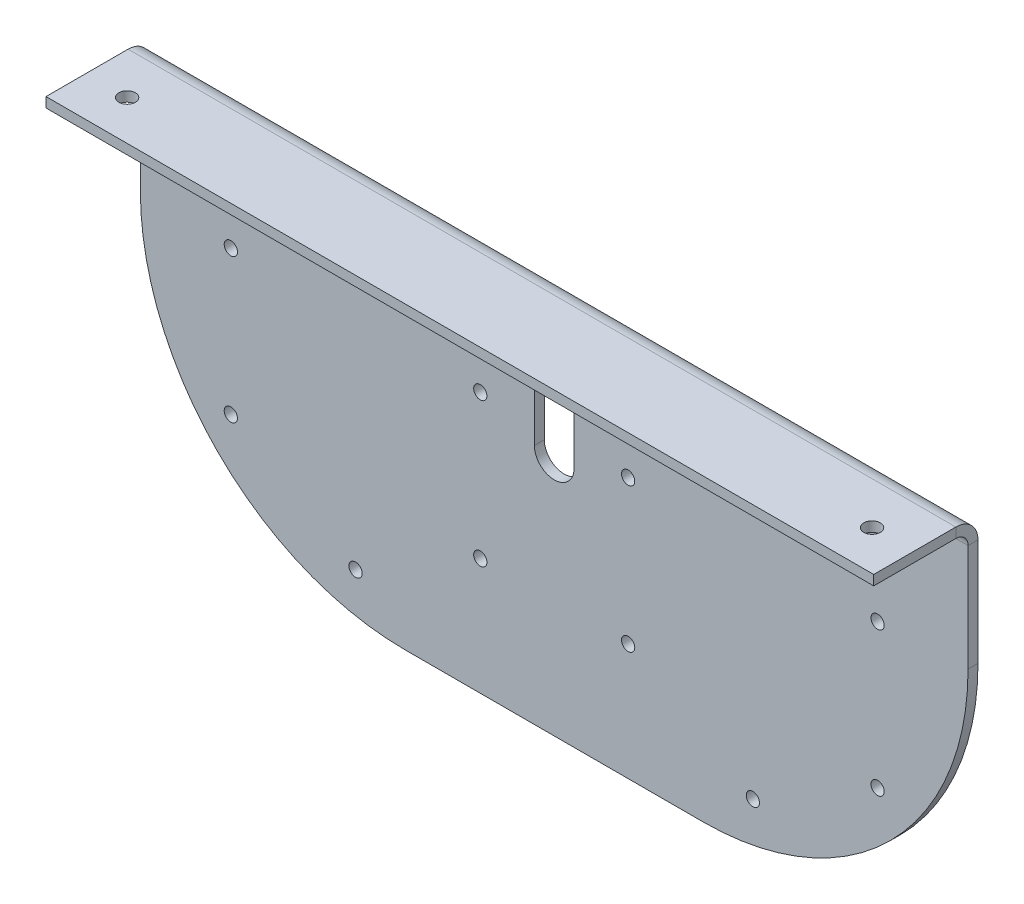
ISO-10303-21;
HEADER;
FILE_DESCRIPTION(('STEP AP214'),'2;1');
FILE_NAME('part.step','',(''),(''),'','','');
FILE_SCHEMA(('AUTOMOTIVE_DESIGN { 1 0 10303 214 1 1 1 1 }'));
ENDSEC;
DATA;
#1=APPLICATION_CONTEXT('core data for automotive mechanical design processes');
#2=APPLICATION_PROTOCOL_DEFINITION('international standard','automotive_design',2000,#1);
#3=PRODUCT_CONTEXT('',#1,'mechanical');
#4=PRODUCT('Part','Part','',(#3));
#5=PRODUCT_RELATED_PRODUCT_CATEGORY('part','',(#4));
#6=PRODUCT_DEFINITION_FORMATION('','',#4);
#7=PRODUCT_DEFINITION_CONTEXT('part definition',#1,'design');
#8=PRODUCT_DEFINITION('design','',#6,#7);
#9=PRODUCT_DEFINITION_SHAPE('','',#8);
#10=(LENGTH_UNIT() NAMED_UNIT(*) SI_UNIT(.MILLI.,.METRE.));
#11=(NAMED_UNIT(*) PLANE_ANGLE_UNIT() SI_UNIT($,.RADIAN.));
#12=(NAMED_UNIT(*) SI_UNIT($,.STERADIAN.) SOLID_ANGLE_UNIT());
#13=UNCERTAINTY_MEASURE_WITH_UNIT(LENGTH_MEASURE(1.E-05),#10,'distance_accuracy_value','');
#14=(GEOMETRIC_REPRESENTATION_CONTEXT(3) GLOBAL_UNCERTAINTY_ASSIGNED_CONTEXT((#13)) GLOBAL_UNIT_ASSIGNED_CONTEXT((#10,
#11,#12)) REPRESENTATION_CONTEXT('',''));
#15=CARTESIAN_POINT('',(0.,0.,0.));
#16=DIRECTION('',(0.,0.,1.));
#17=DIRECTION('',(1.,0.,0.));
#18=AXIS2_PLACEMENT_3D('',#15,#16,#17);
#19=CARTESIAN_POINT('',(-125.,53.5,0.999999999999997));
#20=DIRECTION('',(-1.,0.,0.));
#21=DIRECTION('',(0.,0.,1.));
#22=AXIS2_PLACEMENT_3D('',#19,#20,#21);
#23=PLANE('',#22);
#24=DIRECTION('',(0.,1.,0.));
#25=VECTOR('',#24,1.);
#26=CARTESIAN_POINT('',(-125.,26.5,0.999999999999998));
#27=LINE('',#26,#25);
#28=CARTESIAN_POINT('',(-125.,26.5,0.999999999999998));
#29=VERTEX_POINT('',#28);
#30=CARTESIAN_POINT('',(-125.,58.8,0.999999999999994));
#31=VERTEX_POINT('',#30);
#32=EDGE_CURVE('E351',#29,#31,#27,.T.);
#33=ORIENTED_EDGE('',*,*,#32,.T.);
#34=DIRECTION('',(0.,0.,-1.));
#35=VECTOR('',#34,1.);
#36=CARTESIAN_POINT('',(-125.,58.8,0.999999999999994));
#37=LINE('',#36,#35);
#38=CARTESIAN_POINT('',(-125.,58.8,-2.00000000000001));
#39=VERTEX_POINT('',#38);
#40=EDGE_CURVE('E316',#31,#39,#37,.T.);
#41=ORIENTED_EDGE('',*,*,#40,.T.);
#42=DIRECTION('',(0.,1.,0.));
#43=VECTOR('',#42,1.);
#44=CARTESIAN_POINT('',(-125.,53.5,-2.));
#45=LINE('',#44,#43);
#46=CARTESIAN_POINT('',(-125.,26.5,-2.));
#47=VERTEX_POINT('',#46);
#48=EDGE_CURVE('E370',#47,#39,#45,.T.);
#49=ORIENTED_EDGE('',*,*,#48,.F.);
#50=DIRECTION('',(0.,0.,-1.));
#51=VECTOR('',#50,1.);
#52=CARTESIAN_POINT('',(-125.,26.5,0.999999999999998));
#53=LINE('',#52,#51);
#54=EDGE_CURVE('E73',#29,#47,#53,.T.);
#55=ORIENTED_EDGE('',*,*,#54,.F.);
#56=EDGE_LOOP('',(#33,#41,#49,#55));
#57=FACE_BOUND('',#56,.T.);
#58=ADVANCED_FACE('F63',(#57),#23,.T.);
#59=CARTESIAN_POINT('',(45.,26.5,0.999999999999998));
#60=DIRECTION('',(0.,0.,-1.));
#61=DIRECTION('',(0.,1.,0.));
#62=AXIS2_PLACEMENT_3D('',#59,#60,#61);
#63=PLANE('',#62);
#64=CARTESIAN_POINT('',(-22.327894935377,25.25,0.999999999999997));
#65=DIRECTION('',(0.,0.,-1.));
#66=DIRECTION('',(0.,1.,0.));
#67=AXIS2_PLACEMENT_3D('',#64,#65,#66);
#68=CIRCLE('',#67,2.00000000000001);
#69=CARTESIAN_POINT('',(-22.327894935377,27.25,0.999999999999997));
#70=VERTEX_POINT('',#69);
#71=EDGE_CURVE('E260',#70,#70,#68,.T.);
#72=ORIENTED_EDGE('',*,*,#71,.T.);
#73=EDGE_LOOP('',(#72));
#74=FACE_BOUND('',#73,.T.);
#75=CARTESIAN_POINT('',(22.3278949353769,25.25,0.999999999999997));
#76=DIRECTION('',(0.,0.,-1.));
#77=DIRECTION('',(0.,1.,0.));
#78=AXIS2_PLACEMENT_3D('',#75,#76,#77);
#79=CIRCLE('',#78,2.00000000000001);
#80=CARTESIAN_POINT('',(22.3278949353769,27.25,0.999999999999997));
#81=VERTEX_POINT('',#80);
#82=EDGE_CURVE('E256',#81,#81,#79,.T.);
#83=ORIENTED_EDGE('',*,*,#82,.T.);
#84=EDGE_LOOP('',(#83));
#85=FACE_BOUND('',#84,.T.);
#86=CARTESIAN_POINT('',(22.3278949353769,-18.25,1.));
#87=DIRECTION('',(0.,0.,-1.));
#88=DIRECTION('',(0.,1.,0.));
#89=AXIS2_PLACEMENT_3D('',#86,#87,#88);
#90=CIRCLE('',#89,2.);
#91=CARTESIAN_POINT('',(22.3278949353769,-16.25,1.));
#92=VERTEX_POINT('',#91);
#93=EDGE_CURVE('E252',#92,#92,#90,.T.);
#94=ORIENTED_EDGE('',*,*,#93,.T.);
#95=EDGE_LOOP('',(#94));
#96=FACE_BOUND('',#95,.T.);
#97=CARTESIAN_POINT('',(60.,-40.,1.));
#98=DIRECTION('',(0.,0.,-1.));
#99=DIRECTION('',(0.,1.,0.));
#100=AXIS2_PLACEMENT_3D('',#97,#98,#99);
#101=CIRCLE('',#100,2.);
#102=CARTESIAN_POINT('',(60.,-38.,1.));
#103=VERTEX_POINT('',#102);
#104=EDGE_CURVE('E248',#103,#103,#101,.T.);
#105=ORIENTED_EDGE('',*,*,#104,.T.);
#106=EDGE_LOOP('',(#105));
#107=FACE_BOUND('',#106,.T.);
#108=CARTESIAN_POINT('',(97.6721050646231,-18.25,1.));
#109=DIRECTION('',(0.,0.,-1.));
#110=DIRECTION('',(0.,1.,0.));
#111=AXIS2_PLACEMENT_3D('',#108,#109,#110);
#112=CIRCLE('',#111,2.);
#113=CARTESIAN_POINT('',(97.6721050646231,-16.25,1.));
#114=VERTEX_POINT('',#113);
#115=EDGE_CURVE('E244',#114,#114,#112,.T.);
#116=ORIENTED_EDGE('',*,*,#115,.T.);
#117=EDGE_LOOP('',(#116));
#118=FACE_BOUND('',#117,.T.);
#119=CARTESIAN_POINT('',(-60.0000000000001,47.,0.999999999999997));
#120=DIRECTION('',(0.,0.,-1.));
#121=DIRECTION('',(0.,1.,0.));
#122=AXIS2_PLACEMENT_3D('',#119,#120,#121);
#123=CIRCLE('',#122,2.);
#124=CARTESIAN_POINT('',(-60.0000000000001,49.,0.999999999999996));
#125=VERTEX_POINT('',#124);
#126=EDGE_CURVE('E240',#125,#125,#123,.T.);
#127=ORIENTED_EDGE('',*,*,#126,.T.);
#128=EDGE_LOOP('',(#127));
#129=FACE_BOUND('',#128,.T.);
#130=CARTESIAN_POINT('',(-97.6721050646231,25.25,0.999999999999997));
#131=DIRECTION('',(0.,0.,-1.));
#132=DIRECTION('',(0.,1.,0.));
#133=AXIS2_PLACEMENT_3D('',#130,#131,#132);
#134=CIRCLE('',#133,2.);
#135=CARTESIAN_POINT('',(-97.6721050646231,27.25,0.999999999999997));
#136=VERTEX_POINT('',#135);
#137=EDGE_CURVE('E236',#136,#136,#134,.T.);
#138=ORIENTED_EDGE('',*,*,#137,.T.);
#139=EDGE_LOOP('',(#138));
#140=FACE_BOUND('',#139,.T.);
#141=CARTESIAN_POINT('',(-97.6721050646231,-18.25,1.));
#142=DIRECTION('',(0.,0.,-1.));
#143=DIRECTION('',(0.,1.,0.));
#144=AXIS2_PLACEMENT_3D('',#141,#142,#143);
#145=CIRCLE('',#144,2.);
#146=CARTESIAN_POINT('',(-97.6721050646231,-16.25,1.));
#147=VERTEX_POINT('',#146);
#148=EDGE_CURVE('E232',#147,#147,#145,.T.);
#149=ORIENTED_EDGE('',*,*,#148,.T.);
#150=EDGE_LOOP('',(#149));
#151=FACE_BOUND('',#150,.T.);
#152=CARTESIAN_POINT('',(-22.327894935377,-18.25,1.));
#153=DIRECTION('',(0.,0.,-1.));
#154=DIRECTION('',(0.,1.,0.));
#155=AXIS2_PLACEMENT_3D('',#152,#153,#154);
#156=CIRCLE('',#155,2.);
#157=CARTESIAN_POINT('',(-22.327894935377,-16.25,1.));
#158=VERTEX_POINT('',#157);
#159=EDGE_CURVE('E228',#158,#158,#156,.T.);
#160=ORIENTED_EDGE('',*,*,#159,.T.);
#161=EDGE_LOOP('',(#160));
#162=FACE_BOUND('',#161,.T.);
#163=CARTESIAN_POINT('',(-60.0000000000001,-40.,1.));
#164=DIRECTION('',(0.,0.,-1.));
#165=DIRECTION('',(0.,1.,0.));
#166=AXIS2_PLACEMENT_3D('',#163,#164,#165);
#167=CIRCLE('',#166,2.);
#168=CARTESIAN_POINT('',(-60.0000000000001,-38.,1.));
#169=VERTEX_POINT('',#168);
#170=EDGE_CURVE('E224',#169,#169,#167,.T.);
#171=ORIENTED_EDGE('',*,*,#170,.T.);
#172=EDGE_LOOP('',(#171));
#173=FACE_BOUND('',#172,.T.);
#174=CARTESIAN_POINT('',(60.,47.,0.999999999999997));
#175=DIRECTION('',(0.,0.,-1.));
#176=DIRECTION('',(0.,1.,0.));
#177=AXIS2_PLACEMENT_3D('',#174,#175,#176);
#178=CIRCLE('',#177,2.);
#179=CARTESIAN_POINT('',(60.,49.,0.999999999999996));
#180=VERTEX_POINT('',#179);
#181=EDGE_CURVE('E220',#180,#180,#178,.T.);
#182=ORIENTED_EDGE('',*,*,#181,.T.);
#183=EDGE_LOOP('',(#182));
#184=FACE_BOUND('',#183,.T.);
#185=CARTESIAN_POINT('',(97.6721050646231,25.25,0.999999999999997));
#186=DIRECTION('',(0.,0.,-1.));
#187=DIRECTION('',(0.,1.,0.));
#188=AXIS2_PLACEMENT_3D('',#185,#186,#187);
#189=CIRCLE('',#188,2.);
#190=CARTESIAN_POINT('',(97.6721050646231,27.25,0.999999999999997));
#191=VERTEX_POINT('',#190);
#192=EDGE_CURVE('E216',#191,#191,#189,.T.);
#193=ORIENTED_EDGE('',*,*,#192,.T.);
#194=EDGE_LOOP('',(#193));
#195=FACE_BOUND('',#194,.T.);
#196=DIRECTION('',(0.,1.,0.));
#197=VECTOR('',#196,1.);
#198=CARTESIAN_POINT('',(-6.00000000000001,26.5,0.999999999999998));
#199=LINE('',#198,#197);
#200=CARTESIAN_POINT('',(-6.,19.5,0.999999999999997));
#201=VERTEX_POINT('',#200);
#202=CARTESIAN_POINT('',(-6.,40.5,0.999999999999997));
#203=VERTEX_POINT('',#202);
#204=EDGE_CURVE('E208',#201,#203,#199,.T.);
#205=ORIENTED_EDGE('',*,*,#204,.T.);
#206=CARTESIAN_POINT('',(0.,40.5,0.999999999999997));
#207=DIRECTION('',(0.,0.,-1.));
#208=DIRECTION('',(0.,1.,0.));
#209=AXIS2_PLACEMENT_3D('',#206,#207,#208);
#210=CIRCLE('',#209,6.);
#211=CARTESIAN_POINT('',(6.,40.5,0.999999999999997));
#212=VERTEX_POINT('',#211);
#213=EDGE_CURVE('E212',#203,#212,#210,.T.);
#214=ORIENTED_EDGE('',*,*,#213,.T.);
#215=DIRECTION('',(0.,-1.,0.));
#216=VECTOR('',#215,1.);
#217=CARTESIAN_POINT('',(6.,26.5,0.999999999999998));
#218=LINE('',#217,#216);
#219=CARTESIAN_POINT('',(6.,19.5,0.999999999999998));
#220=VERTEX_POINT('',#219);
#221=EDGE_CURVE('E199',#212,#220,#218,.T.);
#222=ORIENTED_EDGE('',*,*,#221,.T.);
#223=CARTESIAN_POINT('',(0.,19.5,0.999999999999997));
#224=DIRECTION('',(0.,0.,-1.));
#225=DIRECTION('',(0.,1.,0.));
#226=AXIS2_PLACEMENT_3D('',#223,#224,#225);
#227=CIRCLE('',#226,6.);
#228=EDGE_CURVE('E173',#220,#201,#227,.T.);
#229=ORIENTED_EDGE('',*,*,#228,.T.);
#230=EDGE_LOOP('',(#205,#214,#222,#229));
#231=FACE_BOUND('',#230,.T.);
#232=DIRECTION('',(-1.,0.,0.));
#233=VECTOR('',#232,1.);
#234=CARTESIAN_POINT('',(-125.,58.8,0.999999999999994));
#235=LINE('',#234,#233);
#236=CARTESIAN_POINT('',(125.,58.8,0.999999999999994));
#237=VERTEX_POINT('',#236);
#238=EDGE_CURVE('E324',#31,#237,#235,.F.);
#239=ORIENTED_EDGE('',*,*,#238,.F.);
#240=ORIENTED_EDGE('',*,*,#32,.F.);
#241=CARTESIAN_POINT('',(-45.,26.5,0.999999999999998));
#242=DIRECTION('',(0.,0.,-1.));
#243=DIRECTION('',(0.,1.,0.));
#244=AXIS2_PLACEMENT_3D('',#241,#242,#243);
#245=CIRCLE('',#244,80.);
#246=CARTESIAN_POINT('',(-45.,-53.5,1.));
#247=VERTEX_POINT('',#246);
#248=EDGE_CURVE('E347',#247,#29,#245,.T.);
#249=ORIENTED_EDGE('',*,*,#248,.F.);
#250=DIRECTION('',(-1.,0.,0.));
#251=VECTOR('',#250,1.);
#252=CARTESIAN_POINT('',(45.,-53.5,1.));
#253=LINE('',#252,#251);
#254=CARTESIAN_POINT('',(45.,-53.5,1.));
#255=VERTEX_POINT('',#254);
#256=EDGE_CURVE('E342',#255,#247,#253,.T.);
#257=ORIENTED_EDGE('',*,*,#256,.F.);
#258=CARTESIAN_POINT('',(45.,26.5,0.999999999999998));
#259=DIRECTION('',(0.,0.,-1.));
#260=DIRECTION('',(0.,1.,0.));
#261=AXIS2_PLACEMENT_3D('',#258,#259,#260);
#262=CIRCLE('',#261,80.);
#263=CARTESIAN_POINT('',(125.,26.5,0.999999999999998));
#264=VERTEX_POINT('',#263);
#265=EDGE_CURVE('E338',#264,#255,#262,.T.);
#266=ORIENTED_EDGE('',*,*,#265,.F.);
#267=DIRECTION('',(0.,-1.,0.));
#268=VECTOR('',#267,1.);
#269=CARTESIAN_POINT('',(125.,53.5,0.999999999999997));
#270=LINE('',#269,#268);
#271=EDGE_CURVE('E355',#237,#264,#270,.T.);
#272=ORIENTED_EDGE('',*,*,#271,.F.);
#273=EDGE_LOOP('',(#239,#240,#249,#257,#266,#272));
#274=FACE_BOUND('',#273,.T.);
#275=ADVANCED_FACE('F473',(#74,#85,#96,#107,#118,#129,#140,#151,#162,#173,#184,#195,#231,#274),
#63,.F.);
#276=CARTESIAN_POINT('',(45.,26.5,-2.));
#277=DIRECTION('',(0.,0.,-1.));
#278=DIRECTION('',(0.,1.,0.));
#279=AXIS2_PLACEMENT_3D('',#276,#277,#278);
#280=PLANE('',#279);
#281=CARTESIAN_POINT('',(-22.327894935377,25.25,-2.));
#282=DIRECTION('',(0.,0.,-1.));
#283=DIRECTION('',(0.,1.,0.));
#284=AXIS2_PLACEMENT_3D('',#281,#282,#283);
#285=CIRCLE('',#284,2.00000000000001);
#286=CARTESIAN_POINT('',(-22.327894935377,27.25,-2.));
#287=VERTEX_POINT('',#286);
#288=EDGE_CURVE('E408',#287,#287,#285,.T.);
#289=ORIENTED_EDGE('',*,*,#288,.F.);
#290=EDGE_LOOP('',(#289));
#291=FACE_BOUND('',#290,.T.);
#292=CARTESIAN_POINT('',(22.3278949353769,25.25,-2.));
#293=DIRECTION('',(0.,0.,-1.));
#294=DIRECTION('',(0.,1.,0.));
#295=AXIS2_PLACEMENT_3D('',#292,#293,#294);
#296=CIRCLE('',#295,2.00000000000001);
#297=CARTESIAN_POINT('',(22.3278949353769,27.25,-2.));
#298=VERTEX_POINT('',#297);
#299=EDGE_CURVE('E429',#298,#298,#296,.T.);
#300=ORIENTED_EDGE('',*,*,#299,.F.);
#301=EDGE_LOOP('',(#300));
#302=FACE_BOUND('',#301,.T.);
#303=CARTESIAN_POINT('',(22.3278949353769,-18.25,-2.));
#304=DIRECTION('',(0.,0.,-1.));
#305=DIRECTION('',(0.,1.,0.));
#306=AXIS2_PLACEMENT_3D('',#303,#304,#305);
#307=CIRCLE('',#306,2.);
#308=CARTESIAN_POINT('',(22.3278949353769,-16.25,-2.));
#309=VERTEX_POINT('',#308);
#310=EDGE_CURVE('E425',#309,#309,#307,.T.);
#311=ORIENTED_EDGE('',*,*,#310,.F.);
#312=EDGE_LOOP('',(#311));
#313=FACE_BOUND('',#312,.T.);
#314=CARTESIAN_POINT('',(60.,-40.,-2.));
#315=DIRECTION('',(0.,0.,-1.));
#316=DIRECTION('',(0.,1.,0.));
#317=AXIS2_PLACEMENT_3D('',#314,#315,#316);
#318=CIRCLE('',#317,2.);
#319=CARTESIAN_POINT('',(60.,-38.,-2.));
#320=VERTEX_POINT('',#319);
#321=EDGE_CURVE('E420',#320,#320,#318,.T.);
#322=ORIENTED_EDGE('',*,*,#321,.F.);
#323=EDGE_LOOP('',(#322));
#324=FACE_BOUND('',#323,.T.);
#325=CARTESIAN_POINT('',(97.6721050646231,-18.25,-2.));
#326=DIRECTION('',(0.,0.,-1.));
#327=DIRECTION('',(0.,1.,0.));
#328=AXIS2_PLACEMENT_3D('',#325,#326,#327);
#329=CIRCLE('',#328,2.);
#330=CARTESIAN_POINT('',(97.6721050646231,-16.25,-2.));
#331=VERTEX_POINT('',#330);
#332=EDGE_CURVE('E424',#331,#331,#329,.T.);
#333=ORIENTED_EDGE('',*,*,#332,.F.);
#334=EDGE_LOOP('',(#333));
#335=FACE_BOUND('',#334,.T.);
#336=CARTESIAN_POINT('',(-60.0000000000001,47.,-2.));
#337=DIRECTION('',(0.,0.,-1.));
#338=DIRECTION('',(0.,1.,0.));
#339=AXIS2_PLACEMENT_3D('',#336,#337,#338);
#340=CIRCLE('',#339,2.);
#341=CARTESIAN_POINT('',(-60.0000000000001,49.,-2.));
#342=VERTEX_POINT('',#341);
#343=EDGE_CURVE('E444',#342,#342,#340,.T.);
#344=ORIENTED_EDGE('',*,*,#343,.F.);
#345=EDGE_LOOP('',(#344));
#346=FACE_BOUND('',#345,.T.);
#347=CARTESIAN_POINT('',(-97.6721050646231,25.25,-2.));
#348=DIRECTION('',(0.,0.,-1.));
#349=DIRECTION('',(0.,1.,0.));
#350=AXIS2_PLACEMENT_3D('',#347,#348,#349);
#351=CIRCLE('',#350,2.);
#352=CARTESIAN_POINT('',(-97.6721050646231,27.25,-2.));
#353=VERTEX_POINT('',#352);
#354=EDGE_CURVE('E440',#353,#353,#351,.T.);
#355=ORIENTED_EDGE('',*,*,#354,.F.);
#356=EDGE_LOOP('',(#355));
#357=FACE_BOUND('',#356,.T.);
#358=CARTESIAN_POINT('',(-97.6721050646231,-18.25,-2.));
#359=DIRECTION('',(0.,0.,-1.));
#360=DIRECTION('',(0.,1.,0.));
#361=AXIS2_PLACEMENT_3D('',#358,#359,#360);
#362=CIRCLE('',#361,2.);
#363=CARTESIAN_POINT('',(-97.6721050646231,-16.25,-2.));
#364=VERTEX_POINT('',#363);
#365=EDGE_CURVE('E436',#364,#364,#362,.T.);
#366=ORIENTED_EDGE('',*,*,#365,.F.);
#367=EDGE_LOOP('',(#366));
#368=FACE_BOUND('',#367,.T.);
#369=CARTESIAN_POINT('',(-22.327894935377,-18.25,-2.));
#370=DIRECTION('',(0.,0.,-1.));
#371=DIRECTION('',(0.,1.,0.));
#372=AXIS2_PLACEMENT_3D('',#369,#370,#371);
#373=CIRCLE('',#372,2.);
#374=CARTESIAN_POINT('',(-22.327894935377,-16.25,-2.));
#375=VERTEX_POINT('',#374);
#376=EDGE_CURVE('E404',#375,#375,#373,.T.);
#377=ORIENTED_EDGE('',*,*,#376,.F.);
#378=EDGE_LOOP('',(#377));
#379=FACE_BOUND('',#378,.T.);
#380=CARTESIAN_POINT('',(-60.0000000000001,-40.,-2.));
#381=DIRECTION('',(0.,0.,-1.));
#382=DIRECTION('',(0.,1.,0.));
#383=AXIS2_PLACEMENT_3D('',#380,#381,#382);
#384=CIRCLE('',#383,2.);
#385=CARTESIAN_POINT('',(-60.0000000000001,-38.,-2.));
#386=VERTEX_POINT('',#385);
#387=EDGE_CURVE('E409',#386,#386,#384,.T.);
#388=ORIENTED_EDGE('',*,*,#387,.F.);
#389=EDGE_LOOP('',(#388));
#390=FACE_BOUND('',#389,.T.);
#391=CARTESIAN_POINT('',(60.,47.,-2.));
#392=DIRECTION('',(0.,0.,-1.));
#393=DIRECTION('',(0.,1.,0.));
#394=AXIS2_PLACEMENT_3D('',#391,#392,#393);
#395=CIRCLE('',#394,2.);
#396=CARTESIAN_POINT('',(60.,49.,-2.));
#397=VERTEX_POINT('',#396);
#398=EDGE_CURVE('E413',#397,#397,#395,.T.);
#399=ORIENTED_EDGE('',*,*,#398,.F.);
#400=EDGE_LOOP('',(#399));
#401=FACE_BOUND('',#400,.T.);
#402=CARTESIAN_POINT('',(97.6721050646231,25.25,-2.));
#403=DIRECTION('',(0.,0.,-1.));
#404=DIRECTION('',(0.,1.,0.));
#405=AXIS2_PLACEMENT_3D('',#402,#403,#404);
#406=CIRCLE('',#405,2.);
#407=CARTESIAN_POINT('',(97.6721050646231,27.25,-2.));
#408=VERTEX_POINT('',#407);
#409=EDGE_CURVE('E393',#408,#408,#406,.T.);
#410=ORIENTED_EDGE('',*,*,#409,.F.);
#411=EDGE_LOOP('',(#410));
#412=FACE_BOUND('',#411,.T.);
#413=CARTESIAN_POINT('',(0.,40.5,-2.));
#414=DIRECTION('',(0.,0.,-1.));
#415=DIRECTION('',(0.,1.,0.));
#416=AXIS2_PLACEMENT_3D('',#413,#414,#415);
#417=CIRCLE('',#416,6.);
#418=CARTESIAN_POINT('',(-6.,40.5,-2.));
#419=VERTEX_POINT('',#418);
#420=CARTESIAN_POINT('',(6.,40.5,-2.));
#421=VERTEX_POINT('',#420);
#422=EDGE_CURVE('E89',#419,#421,#417,.T.);
#423=ORIENTED_EDGE('',*,*,#422,.F.);
#424=DIRECTION('',(0.,1.,0.));
#425=VECTOR('',#424,1.);
#426=CARTESIAN_POINT('',(-6.,19.5,-2.));
#427=LINE('',#426,#425);
#428=CARTESIAN_POINT('',(-6.,19.5,-2.));
#429=VERTEX_POINT('',#428);
#430=EDGE_CURVE('E188',#429,#419,#427,.T.);
#431=ORIENTED_EDGE('',*,*,#430,.F.);
#432=CARTESIAN_POINT('',(0.,19.5,-2.));
#433=DIRECTION('',(0.,0.,-1.));
#434=DIRECTION('',(0.,1.,0.));
#435=AXIS2_PLACEMENT_3D('',#432,#433,#434);
#436=CIRCLE('',#435,6.);
#437=CARTESIAN_POINT('',(6.,19.5,-2.));
#438=VERTEX_POINT('',#437);
#439=EDGE_CURVE('E170',#438,#429,#436,.T.);
#440=ORIENTED_EDGE('',*,*,#439,.F.);
#441=DIRECTION('',(0.,-1.,0.));
#442=VECTOR('',#441,1.);
#443=CARTESIAN_POINT('',(6.,40.5,-2.));
#444=LINE('',#443,#442);
#445=EDGE_CURVE('E180',#421,#438,#444,.T.);
#446=ORIENTED_EDGE('',*,*,#445,.F.);
#447=EDGE_LOOP('',(#423,#431,#440,#446));
#448=FACE_BOUND('',#447,.T.);
#449=ORIENTED_EDGE('',*,*,#48,.T.);
#450=DIRECTION('',(-1.,0.,0.));
#451=VECTOR('',#450,1.);
#452=CARTESIAN_POINT('',(-125.,58.8,-2.00000000000001));
#453=LINE('',#452,#451);
#454=CARTESIAN_POINT('',(125.,58.8,-2.));
#455=VERTEX_POINT('',#454);
#456=EDGE_CURVE('E307',#39,#455,#453,.F.);
#457=ORIENTED_EDGE('',*,*,#456,.T.);
#458=DIRECTION('',(0.,-1.,0.));
#459=VECTOR('',#458,1.);
#460=CARTESIAN_POINT('',(125.,53.5,-2.));
#461=LINE('',#460,#459);
#462=CARTESIAN_POINT('',(125.,26.5,-2.));
#463=VERTEX_POINT('',#462);
#464=EDGE_CURVE('E343',#455,#463,#461,.T.);
#465=ORIENTED_EDGE('',*,*,#464,.T.);
#466=CARTESIAN_POINT('',(45.,26.5,-2.));
#467=DIRECTION('',(0.,0.,-1.));
#468=DIRECTION('',(0.,1.,0.));
#469=AXIS2_PLACEMENT_3D('',#466,#467,#468);
#470=CIRCLE('',#469,80.);
#471=CARTESIAN_POINT('',(45.,-53.5,-2.));
#472=VERTEX_POINT('',#471);
#473=EDGE_CURVE('E334',#463,#472,#470,.T.);
#474=ORIENTED_EDGE('',*,*,#473,.T.);
#475=DIRECTION('',(-1.,0.,0.));
#476=VECTOR('',#475,1.);
#477=CARTESIAN_POINT('',(45.,-53.5,-2.));
#478=LINE('',#477,#476);
#479=CARTESIAN_POINT('',(-45.,-53.5,-2.));
#480=VERTEX_POINT('',#479);
#481=EDGE_CURVE('E362',#472,#480,#478,.T.);
#482=ORIENTED_EDGE('',*,*,#481,.T.);
#483=CARTESIAN_POINT('',(-45.,26.5,-2.));
#484=DIRECTION('',(0.,0.,-1.));
#485=DIRECTION('',(0.,1.,0.));
#486=AXIS2_PLACEMENT_3D('',#483,#484,#485);
#487=CIRCLE('',#486,80.);
#488=EDGE_CURVE('E366',#480,#47,#487,.T.);
#489=ORIENTED_EDGE('',*,*,#488,.T.);
#490=EDGE_LOOP('',(#449,#457,#465,#474,#482,#489));
#491=FACE_BOUND('',#490,.T.);
#492=ADVANCED_FACE('F185',(#291,#302,#313,#324,#335,#346,#357,#368,#379,#390,#401,#412,#448,
#491),#280,.T.);
#493=CARTESIAN_POINT('',(45.,26.5,0.999999999999998));
#494=DIRECTION('',(0.,0.,-1.));
#495=DIRECTION('',(0.,1.,0.));
#496=AXIS2_PLACEMENT_3D('',#493,#494,#495);
#497=CYLINDRICAL_SURFACE('',#496,80.);
#498=ORIENTED_EDGE('',*,*,#473,.F.);
#499=DIRECTION('',(0.,0.,-1.));
#500=VECTOR('',#499,1.);
#501=CARTESIAN_POINT('',(125.,26.5,0.999999999999998));
#502=LINE('',#501,#500);
#503=EDGE_CURVE('E13',#264,#463,#502,.T.);
#504=ORIENTED_EDGE('',*,*,#503,.F.);
#505=ORIENTED_EDGE('',*,*,#265,.T.);
#506=DIRECTION('',(0.,0.,-1.));
#507=VECTOR('',#506,1.);
#508=CARTESIAN_POINT('',(45.,-53.5,1.));
#509=LINE('',#508,#507);
#510=EDGE_CURVE('E358',#255,#472,#509,.T.);
#511=ORIENTED_EDGE('',*,*,#510,.T.);
#512=EDGE_LOOP('',(#498,#504,#505,#511));
#513=FACE_BOUND('',#512,.T.);
#514=ADVANCED_FACE('F65',(#513),#497,.T.);
#515=CARTESIAN_POINT('',(125.,53.5,0.999999999999997));
#516=DIRECTION('',(1.,0.,0.));
#517=DIRECTION('',(0.,0.,-1.));
#518=AXIS2_PLACEMENT_3D('',#515,#516,#517);
#519=PLANE('',#518);
#520=DIRECTION('',(0.,0.,-1.));
#521=VECTOR('',#520,1.);
#522=CARTESIAN_POINT('',(125.,58.8,0.999999999999994));
#523=LINE('',#522,#521);
#524=EDGE_CURVE('E330',#237,#455,#523,.T.);
#525=ORIENTED_EDGE('',*,*,#524,.F.);
#526=ORIENTED_EDGE('',*,*,#271,.T.);
#527=ORIENTED_EDGE('',*,*,#503,.T.);
#528=ORIENTED_EDGE('',*,*,#464,.F.);
#529=EDGE_LOOP('',(#525,#526,#527,#528));
#530=FACE_BOUND('',#529,.T.);
#531=ADVANCED_FACE('F523',(#530),#519,.T.);
#532=CARTESIAN_POINT('',(-45.,26.5,0.999999999999998));
#533=DIRECTION('',(0.,0.,-1.));
#534=DIRECTION('',(0.,1.,0.));
#535=AXIS2_PLACEMENT_3D('',#532,#533,#534);
#536=CYLINDRICAL_SURFACE('',#535,80.);
#537=ORIENTED_EDGE('',*,*,#488,.F.);
#538=DIRECTION('',(0.,0.,-1.));
#539=VECTOR('',#538,1.);
#540=CARTESIAN_POINT('',(-45.,-53.5,1.));
#541=LINE('',#540,#539);
#542=EDGE_CURVE('E379',#247,#480,#541,.T.);
#543=ORIENTED_EDGE('',*,*,#542,.F.);
#544=ORIENTED_EDGE('',*,*,#248,.T.);
#545=ORIENTED_EDGE('',*,*,#54,.T.);
#546=EDGE_LOOP('',(#537,#543,#544,#545));
#547=FACE_BOUND('',#546,.T.);
#548=ADVANCED_FACE('F512',(#547),#536,.T.);
#549=CARTESIAN_POINT('',(45.,-53.5,1.));
#550=DIRECTION('',(0.,-1.,0.));
#551=DIRECTION('',(0.,0.,-1.));
#552=AXIS2_PLACEMENT_3D('',#549,#550,#551);
#553=PLANE('',#552);
#554=ORIENTED_EDGE('',*,*,#481,.F.);
#555=ORIENTED_EDGE('',*,*,#510,.F.);
#556=ORIENTED_EDGE('',*,*,#256,.T.);
#557=ORIENTED_EDGE('',*,*,#542,.T.);
#558=EDGE_LOOP('',(#554,#555,#556,#557));
#559=FACE_BOUND('',#558,.T.);
#560=ADVANCED_FACE('F516',(#559),#553,.T.);
#561=CARTESIAN_POINT('',(125.,58.8,4.69999999999999));
#562=DIRECTION('',(1.,0.,0.));
#563=DIRECTION('',(0.,0.,-1.));
#564=AXIS2_PLACEMENT_3D('',#561,#562,#563);
#565=PLANE('',#564);
#566=DIRECTION('',(0.,-1.,0.));
#567=VECTOR('',#566,1.);
#568=CARTESIAN_POINT('',(125.,65.5,4.69999999999997));
#569=LINE('',#568,#567);
#570=CARTESIAN_POINT('',(125.,62.5,4.69999999999998));
#571=VERTEX_POINT('',#570);
#572=CARTESIAN_POINT('',(125.,65.5,4.69999999999997));
#573=VERTEX_POINT('',#572);
#574=EDGE_CURVE('E264',#571,#573,#569,.F.);
#575=ORIENTED_EDGE('',*,*,#574,.F.);
#576=CARTESIAN_POINT('',(125.,58.8,4.69999999999999));
#577=DIRECTION('',(-1.,0.,0.));
#578=DIRECTION('',(0.,0.,1.));
#579=AXIS2_PLACEMENT_3D('',#576,#577,#578);
#580=CIRCLE('',#579,3.7);
#581=EDGE_CURVE('E320',#237,#571,#580,.F.);
#582=ORIENTED_EDGE('',*,*,#581,.F.);
#583=ORIENTED_EDGE('',*,*,#524,.T.);
#584=CARTESIAN_POINT('',(125.,58.8,4.69999999999999));
#585=DIRECTION('',(-1.,0.,0.));
#586=DIRECTION('',(0.,0.,1.));
#587=AXIS2_PLACEMENT_3D('',#584,#585,#586);
#588=CIRCLE('',#587,6.7);
#589=EDGE_CURVE('E311',#455,#573,#588,.F.);
#590=ORIENTED_EDGE('',*,*,#589,.T.);
#591=EDGE_LOOP('',(#575,#582,#583,#590));
#592=FACE_BOUND('',#591,.T.);
#593=ADVANCED_FACE('F525',(#592),#565,.T.);
#594=CARTESIAN_POINT('',(-125.,58.8,4.69999999999999));
#595=DIRECTION('',(1.,0.,0.));
#596=DIRECTION('',(0.,0.,-1.));
#597=AXIS2_PLACEMENT_3D('',#594,#595,#596);
#598=PLANE('',#597);
#599=CARTESIAN_POINT('',(-125.,58.8,4.69999999999999));
#600=DIRECTION('',(-1.,0.,0.));
#601=DIRECTION('',(0.,0.,1.));
#602=AXIS2_PLACEMENT_3D('',#599,#600,#601);
#603=CIRCLE('',#602,3.7);
#604=CARTESIAN_POINT('',(-125.,62.5,4.69999999999998));
#605=VERTEX_POINT('',#604);
#606=EDGE_CURVE('E269',#605,#31,#603,.T.);
#607=ORIENTED_EDGE('',*,*,#606,.F.);
#608=DIRECTION('',(0.,-1.,0.));
#609=VECTOR('',#608,1.);
#610=CARTESIAN_POINT('',(-125.,62.5,4.69999999999998));
#611=LINE('',#610,#609);
#612=CARTESIAN_POINT('',(-125.,65.5,4.69999999999997));
#613=VERTEX_POINT('',#612);
#614=EDGE_CURVE('E297',#605,#613,#611,.F.);
#615=ORIENTED_EDGE('',*,*,#614,.T.);
#616=CARTESIAN_POINT('',(-125.,58.8,4.69999999999999));
#617=DIRECTION('',(-1.,0.,0.));
#618=DIRECTION('',(0.,0.,1.));
#619=AXIS2_PLACEMENT_3D('',#616,#617,#618);
#620=CIRCLE('',#619,6.7);
#621=EDGE_CURVE('E312',#613,#39,#620,.T.);
#622=ORIENTED_EDGE('',*,*,#621,.T.);
#623=ORIENTED_EDGE('',*,*,#40,.F.);
#624=EDGE_LOOP('',(#607,#615,#622,#623));
#625=FACE_BOUND('',#624,.T.);
#626=ADVANCED_FACE('F530',(#625),#598,.F.);
#627=CARTESIAN_POINT('',(-125.,58.8,4.69999999999999));
#628=DIRECTION('',(-1.,0.,0.));
#629=DIRECTION('',(0.,1.,0.));
#630=AXIS2_PLACEMENT_3D('',#627,#628,#629);
#631=CYLINDRICAL_SURFACE('',#630,6.7);
#632=ORIENTED_EDGE('',*,*,#456,.F.);
#633=ORIENTED_EDGE('',*,*,#621,.F.);
#634=DIRECTION('',(-1.,0.,0.));
#635=VECTOR('',#634,1.);
#636=CARTESIAN_POINT('',(125.,65.5,4.69999999999997));
#637=LINE('',#636,#635);
#638=EDGE_CURVE('E294',#613,#573,#637,.F.);
#639=ORIENTED_EDGE('',*,*,#638,.T.);
#640=ORIENTED_EDGE('',*,*,#589,.F.);
#641=EDGE_LOOP('',(#632,#633,#639,#640));
#642=FACE_BOUND('',#641,.T.);
#643=ADVANCED_FACE('F527',(#642),#631,.T.);
#644=CARTESIAN_POINT('',(-125.,58.8,4.69999999999999));
#645=DIRECTION('',(-1.,0.,0.));
#646=DIRECTION('',(0.,1.,0.));
#647=AXIS2_PLACEMENT_3D('',#644,#645,#646);
#648=CYLINDRICAL_SURFACE('',#647,3.7);
#649=ORIENTED_EDGE('',*,*,#238,.T.);
#650=ORIENTED_EDGE('',*,*,#581,.T.);
#651=DIRECTION('',(-1.,0.,0.));
#652=VECTOR('',#651,1.);
#653=CARTESIAN_POINT('',(125.,62.5,4.69999999999998));
#654=LINE('',#653,#652);
#655=EDGE_CURVE('E301',#571,#605,#654,.T.);
#656=ORIENTED_EDGE('',*,*,#655,.T.);
#657=ORIENTED_EDGE('',*,*,#606,.T.);
#658=EDGE_LOOP('',(#649,#650,#656,#657));
#659=FACE_BOUND('',#658,.T.);
#660=ADVANCED_FACE('F550',(#659),#648,.F.);
#661=CARTESIAN_POINT('',(-125.,65.5000000000001,29.5));
#662=DIRECTION('',(1.,0.,0.));
#663=DIRECTION('',(0.,0.,-1.));
#664=AXIS2_PLACEMENT_3D('',#661,#662,#663);
#665=PLANE('',#664);
#666=ORIENTED_EDGE('',*,*,#614,.F.);
#667=DIRECTION('',(0.,0.,-1.));
#668=VECTOR('',#667,1.);
#669=CARTESIAN_POINT('',(-125.,62.5000000000001,29.5));
#670=LINE('',#669,#668);
#671=CARTESIAN_POINT('',(-125.,62.5000000000001,29.5));
#672=VERTEX_POINT('',#671);
#673=EDGE_CURVE('E291',#605,#672,#670,.F.);
#674=ORIENTED_EDGE('',*,*,#673,.T.);
#675=DIRECTION('',(0.,-1.,0.));
#676=VECTOR('',#675,1.);
#677=CARTESIAN_POINT('',(-125.,65.5000000000001,29.5));
#678=LINE('',#677,#676);
#679=CARTESIAN_POINT('',(-125.,65.5000000000001,29.5));
#680=VERTEX_POINT('',#679);
#681=EDGE_CURVE('E265',#680,#672,#678,.T.);
#682=ORIENTED_EDGE('',*,*,#681,.F.);
#683=DIRECTION('',(0.,0.,1.));
#684=VECTOR('',#683,1.);
#685=CARTESIAN_POINT('',(-125.,65.5,-2.33736398749264E-13));
#686=LINE('',#685,#684);
#687=EDGE_CURVE('E281',#613,#680,#686,.T.);
#688=ORIENTED_EDGE('',*,*,#687,.F.);
#689=EDGE_LOOP('',(#666,#674,#682,#688));
#690=FACE_BOUND('',#689,.T.);
#691=ADVANCED_FACE('F541',(#690),#665,.F.);
#692=CARTESIAN_POINT('',(125.,65.5,0.999999999999985));
#693=DIRECTION('',(-1.,0.,0.));
#694=DIRECTION('',(0.,0.,1.));
#695=AXIS2_PLACEMENT_3D('',#692,#693,#694);
#696=PLANE('',#695);
#697=ORIENTED_EDGE('',*,*,#574,.T.);
#698=DIRECTION('',(0.,0.,-1.));
#699=VECTOR('',#698,1.);
#700=CARTESIAN_POINT('',(125.,65.5,-2.33736398749264E-13));
#701=LINE('',#700,#699);
#702=CARTESIAN_POINT('',(125.,65.5000000000001,29.5));
#703=VERTEX_POINT('',#702);
#704=EDGE_CURVE('E274',#703,#573,#701,.T.);
#705=ORIENTED_EDGE('',*,*,#704,.F.);
#706=DIRECTION('',(0.,-1.,0.));
#707=VECTOR('',#706,1.);
#708=CARTESIAN_POINT('',(125.,65.5000000000001,29.5));
#709=LINE('',#708,#707);
#710=CARTESIAN_POINT('',(125.,62.5000000000001,29.5));
#711=VERTEX_POINT('',#710);
#712=EDGE_CURVE('E270',#703,#711,#709,.T.);
#713=ORIENTED_EDGE('',*,*,#712,.T.);
#714=DIRECTION('',(0.,0.,1.));
#715=VECTOR('',#714,1.);
#716=CARTESIAN_POINT('',(125.,62.5,0.999999999999995));
#717=LINE('',#716,#715);
#718=EDGE_CURVE('E284',#711,#571,#717,.F.);
#719=ORIENTED_EDGE('',*,*,#718,.T.);
#720=EDGE_LOOP('',(#697,#705,#713,#719));
#721=FACE_BOUND('',#720,.T.);
#722=ADVANCED_FACE('F548',(#721),#696,.F.);
#723=CARTESIAN_POINT('',(0.,65.5,-2.33736398749264E-13));
#724=DIRECTION('',(0.,-1.,0.));
#725=DIRECTION('',(0.,0.,-1.));
#726=AXIS2_PLACEMENT_3D('',#723,#724,#725);
#727=PLANE('',#726);
#728=CARTESIAN_POINT('',(-112.5,65.5,17.5));
#729=DIRECTION('',(0.,1.,0.));
#730=DIRECTION('',(0.,0.,1.));
#731=AXIS2_PLACEMENT_3D('',#728,#729,#730);
#732=CIRCLE('',#731,2.49999999999999);
#733=CARTESIAN_POINT('',(-112.5,65.5000000000001,20.));
#734=VERTEX_POINT('',#733);
#735=EDGE_CURVE('E386',#734,#734,#732,.T.);
#736=ORIENTED_EDGE('',*,*,#735,.F.);
#737=EDGE_LOOP('',(#736));
#738=FACE_BOUND('',#737,.T.);
#739=CARTESIAN_POINT('',(112.5,65.5,17.5));
#740=DIRECTION('',(0.,1.,0.));
#741=DIRECTION('',(0.,0.,1.));
#742=AXIS2_PLACEMENT_3D('',#739,#740,#741);
#743=CIRCLE('',#742,2.50000000000001);
#744=CARTESIAN_POINT('',(112.5,65.5000000000001,20.));
#745=VERTEX_POINT('',#744);
#746=EDGE_CURVE('E395',#745,#745,#743,.T.);
#747=ORIENTED_EDGE('',*,*,#746,.F.);
#748=EDGE_LOOP('',(#747));
#749=FACE_BOUND('',#748,.T.);
#750=ORIENTED_EDGE('',*,*,#638,.F.);
#751=ORIENTED_EDGE('',*,*,#687,.T.);
#752=DIRECTION('',(1.,0.,0.));
#753=VECTOR('',#752,1.);
#754=CARTESIAN_POINT('',(0.,65.5000000000001,29.5));
#755=LINE('',#754,#753);
#756=EDGE_CURVE('E278',#680,#703,#755,.T.);
#757=ORIENTED_EDGE('',*,*,#756,.T.);
#758=ORIENTED_EDGE('',*,*,#704,.T.);
#759=EDGE_LOOP('',(#750,#751,#757,#758));
#760=FACE_BOUND('',#759,.T.);
#761=ADVANCED_FACE('F537',(#738,#749,#760),#727,.F.);
#762=CARTESIAN_POINT('',(0.,62.5,-2.23079565582223E-13));
#763=DIRECTION('',(0.,-1.,0.));
#764=DIRECTION('',(0.,0.,-1.));
#765=AXIS2_PLACEMENT_3D('',#762,#763,#764);
#766=PLANE('',#765);
#767=CARTESIAN_POINT('',(-112.5,62.5,17.5));
#768=DIRECTION('',(0.,-1.,0.));
#769=DIRECTION('',(0.,0.,-1.));
#770=AXIS2_PLACEMENT_3D('',#767,#768,#769);
#771=CIRCLE('',#770,2.49999999999999);
#772=CARTESIAN_POINT('',(-112.5,62.5,15.));
#773=VERTEX_POINT('',#772);
#774=EDGE_CURVE('E67',#773,#773,#771,.T.);
#775=ORIENTED_EDGE('',*,*,#774,.F.);
#776=EDGE_LOOP('',(#775));
#777=FACE_BOUND('',#776,.T.);
#778=CARTESIAN_POINT('',(112.5,62.5,17.5));
#779=DIRECTION('',(0.,-1.,0.));
#780=DIRECTION('',(0.,0.,-1.));
#781=AXIS2_PLACEMENT_3D('',#778,#779,#780);
#782=CIRCLE('',#781,2.50000000000001);
#783=CARTESIAN_POINT('',(112.5,62.5,15.));
#784=VERTEX_POINT('',#783);
#785=EDGE_CURVE('E383',#784,#784,#782,.T.);
#786=ORIENTED_EDGE('',*,*,#785,.F.);
#787=EDGE_LOOP('',(#786));
#788=FACE_BOUND('',#787,.T.);
#789=ORIENTED_EDGE('',*,*,#673,.F.);
#790=ORIENTED_EDGE('',*,*,#655,.F.);
#791=ORIENTED_EDGE('',*,*,#718,.F.);
#792=DIRECTION('',(-1.,0.,0.));
#793=VECTOR('',#792,1.);
#794=CARTESIAN_POINT('',(125.,62.5000000000001,29.5));
#795=LINE('',#794,#793);
#796=EDGE_CURVE('E288',#672,#711,#795,.F.);
#797=ORIENTED_EDGE('',*,*,#796,.F.);
#798=EDGE_LOOP('',(#789,#790,#791,#797));
#799=FACE_BOUND('',#798,.T.);
#800=ADVANCED_FACE('F552',(#777,#788,#799),#766,.T.);
#801=CARTESIAN_POINT('',(125.,65.5000000000001,29.5));
#802=DIRECTION('',(0.,0.,-1.));
#803=DIRECTION('',(0.,1.,0.));
#804=AXIS2_PLACEMENT_3D('',#801,#802,#803);
#805=PLANE('',#804);
#806=ORIENTED_EDGE('',*,*,#796,.T.);
#807=ORIENTED_EDGE('',*,*,#712,.F.);
#808=ORIENTED_EDGE('',*,*,#756,.F.);
#809=ORIENTED_EDGE('',*,*,#681,.T.);
#810=EDGE_LOOP('',(#806,#807,#808,#809));
#811=FACE_BOUND('',#810,.T.);
#812=ADVANCED_FACE('F544',(#811),#805,.F.);
#813=CARTESIAN_POINT('',(0.,40.5,8.));
#814=DIRECTION('',(0.,0.,-1.));
#815=DIRECTION('',(0.,1.,0.));
#816=AXIS2_PLACEMENT_3D('',#813,#814,#815);
#817=CYLINDRICAL_SURFACE('',#816,6.);
#818=DIRECTION('',(0.,0.,-1.));
#819=VECTOR('',#818,1.);
#820=CARTESIAN_POINT('',(-6.,40.5,8.));
#821=LINE('',#820,#819);
#822=EDGE_CURVE('E196',#203,#419,#821,.T.);
#823=ORIENTED_EDGE('',*,*,#822,.T.);
#824=ORIENTED_EDGE('',*,*,#422,.T.);
#825=DIRECTION('',(0.,0.,-1.));
#826=VECTOR('',#825,1.);
#827=CARTESIAN_POINT('',(6.,40.5,8.));
#828=LINE('',#827,#826);
#829=EDGE_CURVE('E177',#212,#421,#828,.T.);
#830=ORIENTED_EDGE('',*,*,#829,.F.);
#831=ORIENTED_EDGE('',*,*,#213,.F.);
#832=EDGE_LOOP('',(#823,#824,#830,#831));
#833=FACE_BOUND('',#832,.T.);
#834=ADVANCED_FACE('F561',(#833),#817,.F.);
#835=CARTESIAN_POINT('',(-6.,19.5,8.));
#836=DIRECTION('',(-1.,0.,0.));
#837=DIRECTION('',(0.,-1.,0.));
#838=AXIS2_PLACEMENT_3D('',#835,#836,#837);
#839=PLANE('',#838);
#840=DIRECTION('',(0.,0.,-1.));
#841=VECTOR('',#840,1.);
#842=CARTESIAN_POINT('',(-6.,19.5,8.));
#843=LINE('',#842,#841);
#844=EDGE_CURVE('E176',#201,#429,#843,.T.);
#845=ORIENTED_EDGE('',*,*,#844,.T.);
#846=ORIENTED_EDGE('',*,*,#430,.T.);
#847=ORIENTED_EDGE('',*,*,#822,.F.);
#848=ORIENTED_EDGE('',*,*,#204,.F.);
#849=EDGE_LOOP('',(#845,#846,#847,#848));
#850=FACE_BOUND('',#849,.T.);
#851=ADVANCED_FACE('F618',(#850),#839,.F.);
#852=CARTESIAN_POINT('',(0.,19.5,8.));
#853=DIRECTION('',(0.,0.,-1.));
#854=DIRECTION('',(0.,1.,0.));
#855=AXIS2_PLACEMENT_3D('',#852,#853,#854);
#856=CYLINDRICAL_SURFACE('',#855,6.);
#857=DIRECTION('',(0.,0.,-1.));
#858=VECTOR('',#857,1.);
#859=CARTESIAN_POINT('',(6.,19.5,8.));
#860=LINE('',#859,#858);
#861=EDGE_CURVE('E81',#220,#438,#860,.T.);
#862=ORIENTED_EDGE('',*,*,#861,.T.);
#863=ORIENTED_EDGE('',*,*,#439,.T.);
#864=ORIENTED_EDGE('',*,*,#844,.F.);
#865=ORIENTED_EDGE('',*,*,#228,.F.);
#866=EDGE_LOOP('',(#862,#863,#864,#865));
#867=FACE_BOUND('',#866,.T.);
#868=ADVANCED_FACE('F167',(#867),#856,.F.);
#869=CARTESIAN_POINT('',(6.,40.5,8.));
#870=DIRECTION('',(1.,0.,0.));
#871=DIRECTION('',(0.,1.,0.));
#872=AXIS2_PLACEMENT_3D('',#869,#870,#871);
#873=PLANE('',#872);
#874=ORIENTED_EDGE('',*,*,#829,.T.);
#875=ORIENTED_EDGE('',*,*,#445,.T.);
#876=ORIENTED_EDGE('',*,*,#861,.F.);
#877=ORIENTED_EDGE('',*,*,#221,.F.);
#878=EDGE_LOOP('',(#874,#875,#876,#877));
#879=FACE_BOUND('',#878,.T.);
#880=ADVANCED_FACE('F181',(#879),#873,.F.);
#881=CARTESIAN_POINT('',(97.6721050646231,25.25,8.));
#882=DIRECTION('',(0.,0.,-1.));
#883=DIRECTION('',(0.,1.,0.));
#884=AXIS2_PLACEMENT_3D('',#881,#882,#883);
#885=CYLINDRICAL_SURFACE('',#884,2.);
#886=ORIENTED_EDGE('',*,*,#409,.T.);
#887=EDGE_LOOP('',(#886));
#888=FACE_BOUND('',#887,.T.);
#889=ORIENTED_EDGE('',*,*,#192,.F.);
#890=EDGE_LOOP('',(#889));
#891=FACE_BOUND('',#890,.T.);
#892=ADVANCED_FACE('F490',(#888,#891),#885,.F.);
#893=CARTESIAN_POINT('',(60.,47.,8.));
#894=DIRECTION('',(0.,0.,-1.));
#895=DIRECTION('',(0.,1.,0.));
#896=AXIS2_PLACEMENT_3D('',#893,#894,#895);
#897=CYLINDRICAL_SURFACE('',#896,2.);
#898=ORIENTED_EDGE('',*,*,#398,.T.);
#899=EDGE_LOOP('',(#898));
#900=FACE_BOUND('',#899,.T.);
#901=ORIENTED_EDGE('',*,*,#181,.F.);
#902=EDGE_LOOP('',(#901));
#903=FACE_BOUND('',#902,.T.);
#904=ADVANCED_FACE('F493',(#900,#903),#897,.F.);
#905=CARTESIAN_POINT('',(-60.0000000000001,-40.,8.));
#906=DIRECTION('',(0.,0.,-1.));
#907=DIRECTION('',(0.,1.,0.));
#908=AXIS2_PLACEMENT_3D('',#905,#906,#907);
#909=CYLINDRICAL_SURFACE('',#908,2.);
#910=ORIENTED_EDGE('',*,*,#387,.T.);
#911=EDGE_LOOP('',(#910));
#912=FACE_BOUND('',#911,.T.);
#913=ORIENTED_EDGE('',*,*,#170,.F.);
#914=EDGE_LOOP('',(#913));
#915=FACE_BOUND('',#914,.T.);
#916=ADVANCED_FACE('F653',(#912,#915),#909,.F.);
#917=CARTESIAN_POINT('',(-22.327894935377,-18.25,8.));
#918=DIRECTION('',(0.,0.,-1.));
#919=DIRECTION('',(0.,1.,0.));
#920=AXIS2_PLACEMENT_3D('',#917,#918,#919);
#921=CYLINDRICAL_SURFACE('',#920,2.);
#922=ORIENTED_EDGE('',*,*,#376,.T.);
#923=EDGE_LOOP('',(#922));
#924=FACE_BOUND('',#923,.T.);
#925=ORIENTED_EDGE('',*,*,#159,.F.);
#926=EDGE_LOOP('',(#925));
#927=FACE_BOUND('',#926,.T.);
#928=ADVANCED_FACE('F662',(#924,#927),#921,.F.);
#929=CARTESIAN_POINT('',(-97.6721050646231,-18.25,8.));
#930=DIRECTION('',(0.,0.,-1.));
#931=DIRECTION('',(0.,1.,0.));
#932=AXIS2_PLACEMENT_3D('',#929,#930,#931);
#933=CYLINDRICAL_SURFACE('',#932,2.);
#934=ORIENTED_EDGE('',*,*,#365,.T.);
#935=EDGE_LOOP('',(#934));
#936=FACE_BOUND('',#935,.T.);
#937=ORIENTED_EDGE('',*,*,#148,.F.);
#938=EDGE_LOOP('',(#937));
#939=FACE_BOUND('',#938,.T.);
#940=ADVANCED_FACE('F671',(#936,#939),#933,.F.);
#941=CARTESIAN_POINT('',(-97.6721050646231,25.25,8.));
#942=DIRECTION('',(0.,0.,-1.));
#943=DIRECTION('',(0.,1.,0.));
#944=AXIS2_PLACEMENT_3D('',#941,#942,#943);
#945=CYLINDRICAL_SURFACE('',#944,2.);
#946=ORIENTED_EDGE('',*,*,#354,.T.);
#947=EDGE_LOOP('',(#946));
#948=FACE_BOUND('',#947,.T.);
#949=ORIENTED_EDGE('',*,*,#137,.F.);
#950=EDGE_LOOP('',(#949));
#951=FACE_BOUND('',#950,.T.);
#952=ADVANCED_FACE('F680',(#948,#951),#945,.F.);
#953=CARTESIAN_POINT('',(-60.0000000000001,47.,8.));
#954=DIRECTION('',(0.,0.,-1.));
#955=DIRECTION('',(0.,1.,0.));
#956=AXIS2_PLACEMENT_3D('',#953,#954,#955);
#957=CYLINDRICAL_SURFACE('',#956,2.);
#958=ORIENTED_EDGE('',*,*,#343,.T.);
#959=EDGE_LOOP('',(#958));
#960=FACE_BOUND('',#959,.T.);
#961=ORIENTED_EDGE('',*,*,#126,.F.);
#962=EDGE_LOOP('',(#961));
#963=FACE_BOUND('',#962,.T.);
#964=ADVANCED_FACE('F689',(#960,#963),#957,.F.);
#965=CARTESIAN_POINT('',(97.6721050646231,-18.25,8.));
#966=DIRECTION('',(0.,0.,-1.));
#967=DIRECTION('',(0.,1.,0.));
#968=AXIS2_PLACEMENT_3D('',#965,#966,#967);
#969=CYLINDRICAL_SURFACE('',#968,2.);
#970=ORIENTED_EDGE('',*,*,#332,.T.);
#971=EDGE_LOOP('',(#970));
#972=FACE_BOUND('',#971,.T.);
#973=ORIENTED_EDGE('',*,*,#115,.F.);
#974=EDGE_LOOP('',(#973));
#975=FACE_BOUND('',#974,.T.);
#976=ADVANCED_FACE('F468',(#972,#975),#969,.F.);
#977=CARTESIAN_POINT('',(60.,-40.,8.));
#978=DIRECTION('',(0.,0.,-1.));
#979=DIRECTION('',(0.,1.,0.));
#980=AXIS2_PLACEMENT_3D('',#977,#978,#979);
#981=CYLINDRICAL_SURFACE('',#980,2.);
#982=ORIENTED_EDGE('',*,*,#321,.T.);
#983=EDGE_LOOP('',(#982));
#984=FACE_BOUND('',#983,.T.);
#985=ORIENTED_EDGE('',*,*,#104,.F.);
#986=EDGE_LOOP('',(#985));
#987=FACE_BOUND('',#986,.T.);
#988=ADVANCED_FACE('F706',(#984,#987),#981,.F.);
#989=CARTESIAN_POINT('',(22.3278949353769,-18.25,8.));
#990=DIRECTION('',(0.,0.,-1.));
#991=DIRECTION('',(0.,1.,0.));
#992=AXIS2_PLACEMENT_3D('',#989,#990,#991);
#993=CYLINDRICAL_SURFACE('',#992,2.);
#994=ORIENTED_EDGE('',*,*,#310,.T.);
#995=EDGE_LOOP('',(#994));
#996=FACE_BOUND('',#995,.T.);
#997=ORIENTED_EDGE('',*,*,#93,.F.);
#998=EDGE_LOOP('',(#997));
#999=FACE_BOUND('',#998,.T.);
#1000=ADVANCED_FACE('F714',(#996,#999),#993,.F.);
#1001=CARTESIAN_POINT('',(22.3278949353769,25.25,8.));
#1002=DIRECTION('',(0.,0.,-1.));
#1003=DIRECTION('',(0.,1.,0.));
#1004=AXIS2_PLACEMENT_3D('',#1001,#1002,#1003);
#1005=CYLINDRICAL_SURFACE('',#1004,2.00000000000001);
#1006=ORIENTED_EDGE('',*,*,#299,.T.);
#1007=EDGE_LOOP('',(#1006));
#1008=FACE_BOUND('',#1007,.T.);
#1009=ORIENTED_EDGE('',*,*,#82,.F.);
#1010=EDGE_LOOP('',(#1009));
#1011=FACE_BOUND('',#1010,.T.);
#1012=ADVANCED_FACE('F723',(#1008,#1011),#1005,.F.);
#1013=CARTESIAN_POINT('',(-22.327894935377,25.25,8.));
#1014=DIRECTION('',(0.,0.,-1.));
#1015=DIRECTION('',(0.,1.,0.));
#1016=AXIS2_PLACEMENT_3D('',#1013,#1014,#1015);
#1017=CYLINDRICAL_SURFACE('',#1016,2.00000000000001);
#1018=ORIENTED_EDGE('',*,*,#288,.T.);
#1019=EDGE_LOOP('',(#1018));
#1020=FACE_BOUND('',#1019,.T.);
#1021=ORIENTED_EDGE('',*,*,#71,.F.);
#1022=EDGE_LOOP('',(#1021));
#1023=FACE_BOUND('',#1022,.T.);
#1024=ADVANCED_FACE('F732',(#1020,#1023),#1017,.F.);
#1025=CARTESIAN_POINT('',(112.5,55.5,17.5));
#1026=DIRECTION('',(0.,1.,0.));
#1027=DIRECTION('',(0.,0.,1.));
#1028=AXIS2_PLACEMENT_3D('',#1025,#1026,#1027);
#1029=CYLINDRICAL_SURFACE('',#1028,2.50000000000001);
#1030=ORIENTED_EDGE('',*,*,#785,.T.);
#1031=EDGE_LOOP('',(#1030));
#1032=FACE_BOUND('',#1031,.T.);
#1033=ORIENTED_EDGE('',*,*,#746,.T.);
#1034=EDGE_LOOP('',(#1033));
#1035=FACE_BOUND('',#1034,.T.);
#1036=ADVANCED_FACE('F740',(#1032,#1035),#1029,.F.);
#1037=CARTESIAN_POINT('',(-112.5,55.5,17.5));
#1038=DIRECTION('',(0.,1.,0.));
#1039=DIRECTION('',(0.,0.,1.));
#1040=AXIS2_PLACEMENT_3D('',#1037,#1038,#1039);
#1041=CYLINDRICAL_SURFACE('',#1040,2.49999999999999);
#1042=ORIENTED_EDGE('',*,*,#774,.T.);
#1043=EDGE_LOOP('',(#1042));
#1044=FACE_BOUND('',#1043,.T.);
#1045=ORIENTED_EDGE('',*,*,#735,.T.);
#1046=EDGE_LOOP('',(#1045));
#1047=FACE_BOUND('',#1046,.T.);
#1048=ADVANCED_FACE('F781',(#1044,#1047),#1041,.F.);
#1049=CLOSED_SHELL('',(#58,#275,#492,#514,#531,#548,#560,#593,#626,#643,#660,#691,#722,#761,
#800,#812,#834,#851,#868,#880,#892,#904,#916,#928,#940,#952,#964,#976,#988,#1000,#1012,#1024,
#1036,#1048));
#1050=MANIFOLD_SOLID_BREP('B2',#1049);
#1051=ADVANCED_BREP_SHAPE_REPRESENTATION('',(#18,#1050),#14);
#1052=SHAPE_DEFINITION_REPRESENTATION(#9,#1051);
ENDSEC;
END-ISO-10303-21;
